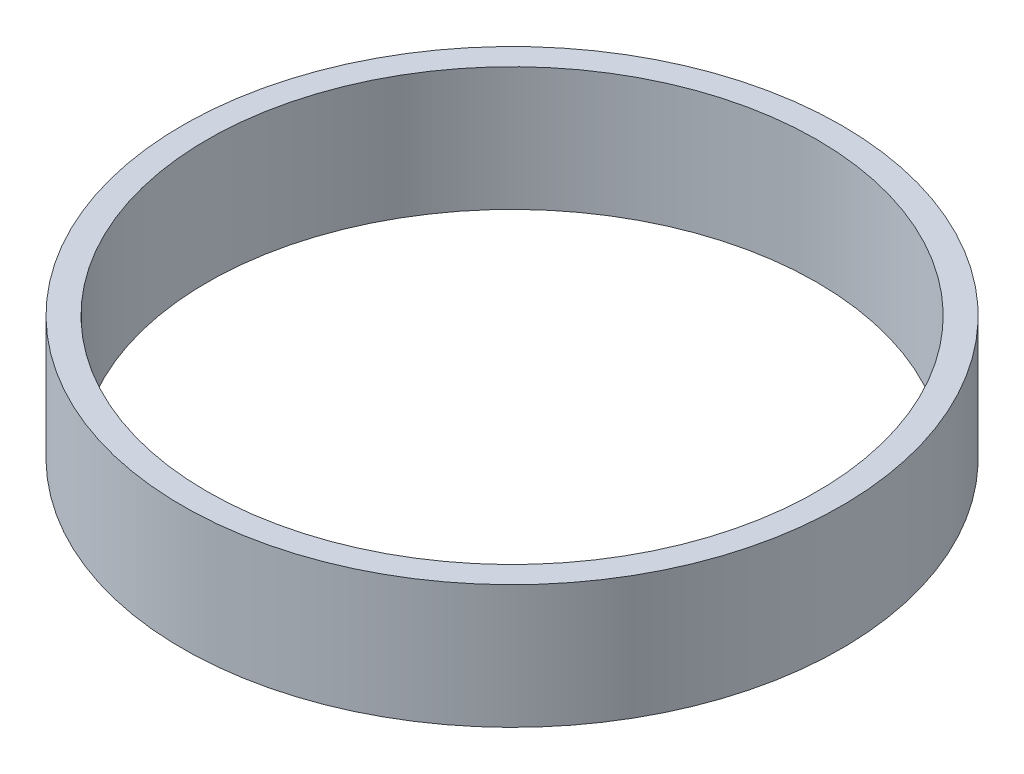
ISO-10303-21;
HEADER;
FILE_DESCRIPTION(('STEP AP214'),'2;1');
FILE_NAME('part.step','',(''),(''),'','','');
FILE_SCHEMA(('AUTOMOTIVE_DESIGN { 1 0 10303 214 1 1 1 1 }'));
ENDSEC;
DATA;
#1=APPLICATION_CONTEXT('core data for automotive mechanical design processes');
#2=APPLICATION_PROTOCOL_DEFINITION('international standard','automotive_design',2000,#1);
#3=PRODUCT_CONTEXT('',#1,'mechanical');
#4=PRODUCT('Part','Part','',(#3));
#5=PRODUCT_RELATED_PRODUCT_CATEGORY('part','',(#4));
#6=PRODUCT_DEFINITION_FORMATION('','',#4);
#7=PRODUCT_DEFINITION_CONTEXT('part definition',#1,'design');
#8=PRODUCT_DEFINITION('design','',#6,#7);
#9=PRODUCT_DEFINITION_SHAPE('','',#8);
#10=(LENGTH_UNIT() NAMED_UNIT(*) SI_UNIT(.MILLI.,.METRE.));
#11=(NAMED_UNIT(*) PLANE_ANGLE_UNIT() SI_UNIT($,.RADIAN.));
#12=(NAMED_UNIT(*) SI_UNIT($,.STERADIAN.) SOLID_ANGLE_UNIT());
#13=UNCERTAINTY_MEASURE_WITH_UNIT(LENGTH_MEASURE(1.E-05),#10,'distance_accuracy_value','');
#14=(GEOMETRIC_REPRESENTATION_CONTEXT(3) GLOBAL_UNCERTAINTY_ASSIGNED_CONTEXT((#13)) GLOBAL_UNIT_ASSIGNED_CONTEXT((#10,
#11,#12)) REPRESENTATION_CONTEXT('',''));
#15=CARTESIAN_POINT('',(0.,0.,0.));
#16=DIRECTION('',(0.,0.,1.));
#17=DIRECTION('',(1.,0.,0.));
#18=AXIS2_PLACEMENT_3D('',#15,#16,#17);
#19=CARTESIAN_POINT('',(0.,19.05,0.));
#20=DIRECTION('',(0.,-1.,0.));
#21=DIRECTION('',(0.,0.,-1.));
#22=AXIS2_PLACEMENT_3D('',#19,#20,#21);
#23=CYLINDRICAL_SURFACE('',#22,93.98);
#24=CARTESIAN_POINT('',(0.,-19.05,0.));
#25=DIRECTION('',(0.,-1.,0.));
#26=DIRECTION('',(0.,0.,-1.));
#27=AXIS2_PLACEMENT_3D('',#24,#25,#26);
#28=CIRCLE('',#27,93.98);
#29=CARTESIAN_POINT('',(0.,-19.05,-93.98));
#30=VERTEX_POINT('',#29);
#31=EDGE_CURVE('E27',#30,#30,#28,.T.);
#32=ORIENTED_EDGE('',*,*,#31,.T.);
#33=EDGE_LOOP('',(#32));
#34=FACE_BOUND('',#33,.T.);
#35=CARTESIAN_POINT('',(0.,19.05,0.));
#36=DIRECTION('',(0.,-1.,0.));
#37=DIRECTION('',(0.,0.,-1.));
#38=AXIS2_PLACEMENT_3D('',#35,#36,#37);
#39=CIRCLE('',#38,93.98);
#40=CARTESIAN_POINT('',(0.,19.05,-93.98));
#41=VERTEX_POINT('',#40);
#42=EDGE_CURVE('E18',#41,#41,#39,.T.);
#43=ORIENTED_EDGE('',*,*,#42,.F.);
#44=EDGE_LOOP('',(#43));
#45=FACE_BOUND('',#44,.T.);
#46=ADVANCED_FACE('F15',(#34,#45),#23,.F.);
#47=CARTESIAN_POINT('',(0.,19.05,0.));
#48=DIRECTION('',(0.,1.,0.));
#49=DIRECTION('',(0.,0.,1.));
#50=AXIS2_PLACEMENT_3D('',#47,#48,#49);
#51=PLANE('',#50);
#52=ORIENTED_EDGE('',*,*,#42,.T.);
#53=EDGE_LOOP('',(#52));
#54=FACE_BOUND('',#53,.T.);
#55=CARTESIAN_POINT('',(0.,19.05,0.));
#56=DIRECTION('',(0.,-1.,0.));
#57=DIRECTION('',(0.,0.,-1.));
#58=AXIS2_PLACEMENT_3D('',#55,#56,#57);
#59=CIRCLE('',#58,101.6);
#60=CARTESIAN_POINT('',(0.,19.05,-101.6));
#61=VERTEX_POINT('',#60);
#62=EDGE_CURVE('E22',#61,#61,#59,.T.);
#63=ORIENTED_EDGE('',*,*,#62,.F.);
#64=EDGE_LOOP('',(#63));
#65=FACE_BOUND('',#64,.T.);
#66=ADVANCED_FACE('F35',(#54,#65),#51,.T.);
#67=CARTESIAN_POINT('',(0.,-19.05,0.));
#68=DIRECTION('',(0.,1.,0.));
#69=DIRECTION('',(0.,0.,1.));
#70=AXIS2_PLACEMENT_3D('',#67,#68,#69);
#71=PLANE('',#70);
#72=ORIENTED_EDGE('',*,*,#31,.F.);
#73=EDGE_LOOP('',(#72));
#74=FACE_BOUND('',#73,.T.);
#75=CARTESIAN_POINT('',(0.,-19.05,0.));
#76=DIRECTION('',(0.,-1.,0.));
#77=DIRECTION('',(0.,0.,-1.));
#78=AXIS2_PLACEMENT_3D('',#75,#76,#77);
#79=CIRCLE('',#78,101.6);
#80=CARTESIAN_POINT('',(0.,-19.05,-101.6));
#81=VERTEX_POINT('',#80);
#82=EDGE_CURVE('E10',#81,#81,#79,.F.);
#83=ORIENTED_EDGE('',*,*,#82,.F.);
#84=EDGE_LOOP('',(#83));
#85=FACE_BOUND('',#84,.T.);
#86=ADVANCED_FACE('F43',(#74,#85),#71,.F.);
#87=CARTESIAN_POINT('',(0.,19.05,0.));
#88=DIRECTION('',(0.,-1.,0.));
#89=DIRECTION('',(0.,0.,-1.));
#90=AXIS2_PLACEMENT_3D('',#87,#88,#89);
#91=CYLINDRICAL_SURFACE('',#90,101.6);
#92=ORIENTED_EDGE('',*,*,#82,.T.);
#93=EDGE_LOOP('',(#92));
#94=FACE_BOUND('',#93,.T.);
#95=ORIENTED_EDGE('',*,*,#62,.T.);
#96=EDGE_LOOP('',(#95));
#97=FACE_BOUND('',#96,.T.);
#98=ADVANCED_FACE('F44',(#94,#97),#91,.T.);
#99=CLOSED_SHELL('',(#46,#66,#86,#98));
#100=MANIFOLD_SOLID_BREP('B1',#99);
#101=ADVANCED_BREP_SHAPE_REPRESENTATION('',(#18,#100),#14);
#102=SHAPE_DEFINITION_REPRESENTATION(#9,#101);
ENDSEC;
END-ISO-10303-21;
